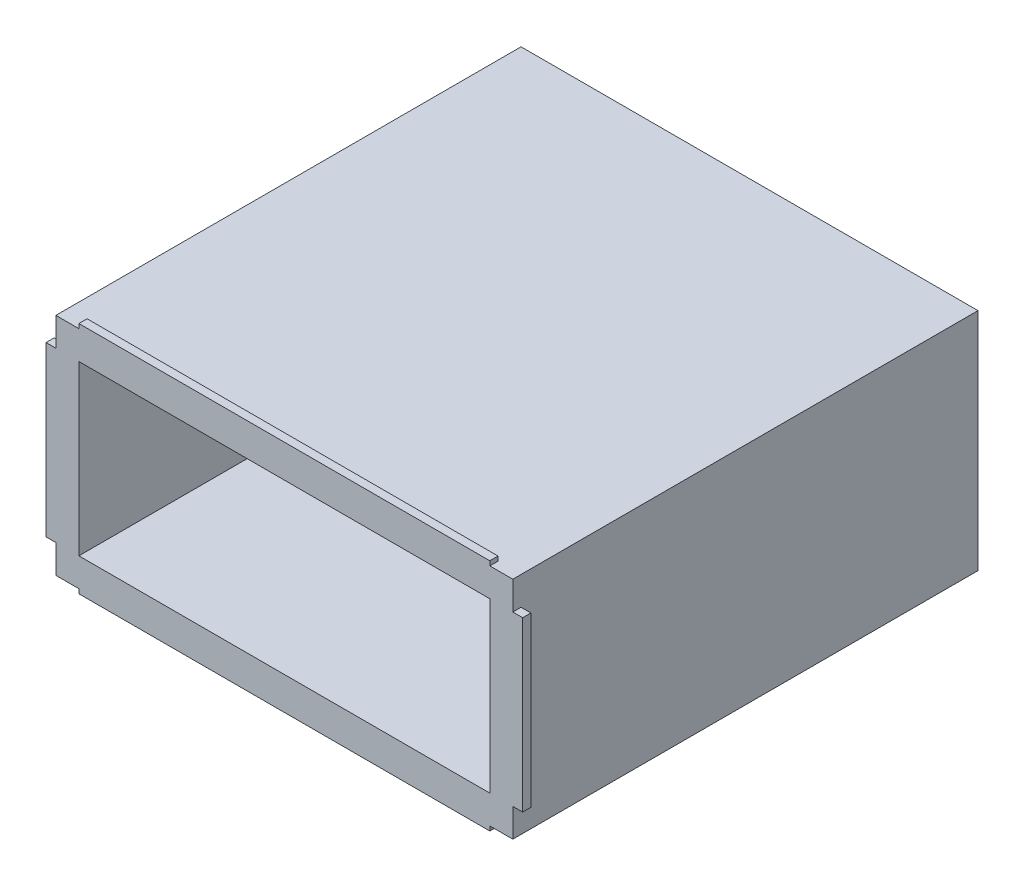
ISO-10303-21;
HEADER;
FILE_DESCRIPTION(('STEP AP214'),'2;1');
FILE_NAME('part.step','',(''),(''),'','','');
FILE_SCHEMA(('AUTOMOTIVE_DESIGN { 1 0 10303 214 1 1 1 1 }'));
ENDSEC;
DATA;
#1=APPLICATION_CONTEXT('core data for automotive mechanical design processes');
#2=APPLICATION_PROTOCOL_DEFINITION('international standard','automotive_design',2000,#1);
#3=PRODUCT_CONTEXT('',#1,'mechanical');
#4=PRODUCT('Part','Part','',(#3));
#5=PRODUCT_RELATED_PRODUCT_CATEGORY('part','',(#4));
#6=PRODUCT_DEFINITION_FORMATION('','',#4);
#7=PRODUCT_DEFINITION_CONTEXT('part definition',#1,'design');
#8=PRODUCT_DEFINITION('design','',#6,#7);
#9=PRODUCT_DEFINITION_SHAPE('','',#8);
#10=(LENGTH_UNIT() NAMED_UNIT(*) SI_UNIT(.MILLI.,.METRE.));
#11=(NAMED_UNIT(*) PLANE_ANGLE_UNIT() SI_UNIT($,.RADIAN.));
#12=(NAMED_UNIT(*) SI_UNIT($,.STERADIAN.) SOLID_ANGLE_UNIT());
#13=UNCERTAINTY_MEASURE_WITH_UNIT(LENGTH_MEASURE(1.E-05),#10,'distance_accuracy_value','');
#14=(GEOMETRIC_REPRESENTATION_CONTEXT(3) GLOBAL_UNCERTAINTY_ASSIGNED_CONTEXT((#13)) GLOBAL_UNIT_ASSIGNED_CONTEXT((#10,
#11,#12)) REPRESENTATION_CONTEXT('',''));
#15=CARTESIAN_POINT('',(0.,0.,0.));
#16=DIRECTION('',(0.,0.,1.));
#17=DIRECTION('',(1.,0.,0.));
#18=AXIS2_PLACEMENT_3D('',#15,#16,#17);
#19=CARTESIAN_POINT('',(6.95,-3.425,14.15));
#20=DIRECTION('',(-1.,0.,0.));
#21=DIRECTION('',(0.,0.,1.));
#22=AXIS2_PLACEMENT_3D('',#19,#20,#21);
#23=PLANE('',#22);
#24=DIRECTION('',(0.,0.,-1.));
#25=VECTOR('',#24,1.);
#26=CARTESIAN_POINT('',(6.95,-2.56,13.9));
#27=LINE('',#26,#25);
#28=CARTESIAN_POINT('',(6.95,-2.56,14.15));
#29=VERTEX_POINT('',#28);
#30=CARTESIAN_POINT('',(6.95,-2.56,13.9));
#31=VERTEX_POINT('',#30);
#32=EDGE_CURVE('E232',#29,#31,#27,.T.);
#33=ORIENTED_EDGE('',*,*,#32,.F.);
#34=DIRECTION('',(0.,1.,0.));
#35=VECTOR('',#34,1.);
#36=CARTESIAN_POINT('',(6.95,-3.425,14.15));
#37=LINE('',#36,#35);
#38=CARTESIAN_POINT('',(6.95,-3.425,14.15));
#39=VERTEX_POINT('',#38);
#40=EDGE_CURVE('E348',#39,#29,#37,.T.);
#41=ORIENTED_EDGE('',*,*,#40,.F.);
#42=DIRECTION('',(0.,0.,-1.));
#43=VECTOR('',#42,1.);
#44=CARTESIAN_POINT('',(6.95,-3.425,14.15));
#45=LINE('',#44,#43);
#46=CARTESIAN_POINT('',(6.95,-3.425,0.));
#47=VERTEX_POINT('',#46);
#48=EDGE_CURVE('E364',#39,#47,#45,.T.);
#49=ORIENTED_EDGE('',*,*,#48,.T.);
#50=DIRECTION('',(0.,1.,0.));
#51=VECTOR('',#50,1.);
#52=CARTESIAN_POINT('',(6.95,-3.425,0.));
#53=LINE('',#52,#51);
#54=CARTESIAN_POINT('',(6.95,3.425,0.));
#55=VERTEX_POINT('',#54);
#56=EDGE_CURVE('E341',#47,#55,#53,.T.);
#57=ORIENTED_EDGE('',*,*,#56,.T.);
#58=DIRECTION('',(0.,0.,-1.));
#59=VECTOR('',#58,1.);
#60=CARTESIAN_POINT('',(6.95,3.425,14.15));
#61=LINE('',#60,#59);
#62=CARTESIAN_POINT('',(6.95,3.425,14.15));
#63=VERTEX_POINT('',#62);
#64=EDGE_CURVE('E11',#63,#55,#61,.T.);
#65=ORIENTED_EDGE('',*,*,#64,.F.);
#66=CARTESIAN_POINT('',(6.95,2.56,14.15));
#67=VERTEX_POINT('',#66);
#68=EDGE_CURVE('E352',#67,#63,#37,.T.);
#69=ORIENTED_EDGE('',*,*,#68,.F.);
#70=DIRECTION('',(0.,0.,1.));
#71=VECTOR('',#70,1.);
#72=CARTESIAN_POINT('',(6.95,2.56,13.9));
#73=LINE('',#72,#71);
#74=CARTESIAN_POINT('',(6.95,2.56,13.9));
#75=VERTEX_POINT('',#74);
#76=EDGE_CURVE('E240',#75,#67,#73,.T.);
#77=ORIENTED_EDGE('',*,*,#76,.F.);
#78=DIRECTION('',(0.,1.,0.));
#79=VECTOR('',#78,1.);
#80=CARTESIAN_POINT('',(6.95,2.56,13.9));
#81=LINE('',#80,#79);
#82=EDGE_CURVE('E55',#31,#75,#81,.T.);
#83=ORIENTED_EDGE('',*,*,#82,.F.);
#84=EDGE_LOOP('',(#33,#41,#49,#57,#65,#69,#77,#83));
#85=FACE_BOUND('',#84,.T.);
#86=ADVANCED_FACE('F33',(#85),#23,.F.);
#87=CARTESIAN_POINT('',(-6.95,3.425,14.15));
#88=DIRECTION('',(0.,-1.,0.));
#89=DIRECTION('',(0.,0.,-1.));
#90=AXIS2_PLACEMENT_3D('',#87,#88,#89);
#91=PLANE('',#90);
#92=DIRECTION('',(0.,0.,1.));
#93=VECTOR('',#92,1.);
#94=CARTESIAN_POINT('',(-6.25,3.425,14.15));
#95=LINE('',#94,#93);
#96=CARTESIAN_POINT('',(-6.25,3.425,13.9));
#97=VERTEX_POINT('',#96);
#98=CARTESIAN_POINT('',(-6.25,3.425,14.15));
#99=VERTEX_POINT('',#98);
#100=EDGE_CURVE('E285',#97,#99,#95,.T.);
#101=ORIENTED_EDGE('',*,*,#100,.F.);
#102=DIRECTION('',(-1.,0.,0.));
#103=VECTOR('',#102,1.);
#104=CARTESIAN_POINT('',(-6.25,3.425,13.9));
#105=LINE('',#104,#103);
#106=CARTESIAN_POINT('',(6.25,3.425,13.9));
#107=VERTEX_POINT('',#106);
#108=EDGE_CURVE('E290',#107,#97,#105,.T.);
#109=ORIENTED_EDGE('',*,*,#108,.F.);
#110=DIRECTION('',(0.,0.,-1.));
#111=VECTOR('',#110,1.);
#112=CARTESIAN_POINT('',(6.25,3.425,14.15));
#113=LINE('',#112,#111);
#114=CARTESIAN_POINT('',(6.25,3.425,14.15));
#115=VERTEX_POINT('',#114);
#116=EDGE_CURVE('E299',#115,#107,#113,.T.);
#117=ORIENTED_EDGE('',*,*,#116,.F.);
#118=DIRECTION('',(-1.,0.,0.));
#119=VECTOR('',#118,1.);
#120=CARTESIAN_POINT('',(-6.95,3.425,14.15));
#121=LINE('',#120,#119);
#122=EDGE_CURVE('E353',#63,#115,#121,.T.);
#123=ORIENTED_EDGE('',*,*,#122,.F.);
#124=ORIENTED_EDGE('',*,*,#64,.T.);
#125=DIRECTION('',(-1.,0.,0.));
#126=VECTOR('',#125,1.);
#127=CARTESIAN_POINT('',(-6.95,3.425,0.));
#128=LINE('',#127,#126);
#129=CARTESIAN_POINT('',(-6.95,3.425,0.));
#130=VERTEX_POINT('',#129);
#131=EDGE_CURVE('E367',#55,#130,#128,.T.);
#132=ORIENTED_EDGE('',*,*,#131,.T.);
#133=DIRECTION('',(0.,0.,-1.));
#134=VECTOR('',#133,1.);
#135=CARTESIAN_POINT('',(-6.95,3.425,14.15));
#136=LINE('',#135,#134);
#137=CARTESIAN_POINT('',(-6.95,3.425,14.15));
#138=VERTEX_POINT('',#137);
#139=EDGE_CURVE('E40',#138,#130,#136,.T.);
#140=ORIENTED_EDGE('',*,*,#139,.F.);
#141=EDGE_CURVE('E351',#99,#138,#121,.T.);
#142=ORIENTED_EDGE('',*,*,#141,.F.);
#143=EDGE_LOOP('',(#101,#109,#117,#123,#124,#132,#140,#142));
#144=FACE_BOUND('',#143,.T.);
#145=ADVANCED_FACE('F412',(#144),#91,.F.);
#146=CARTESIAN_POINT('',(-6.95,-3.425,14.15));
#147=DIRECTION('',(1.,0.,0.));
#148=DIRECTION('',(0.,0.,-1.));
#149=AXIS2_PLACEMENT_3D('',#146,#147,#148);
#150=PLANE('',#149);
#151=DIRECTION('',(0.,1.,0.));
#152=VECTOR('',#151,1.);
#153=CARTESIAN_POINT('',(-6.95,2.56,13.9));
#154=LINE('',#153,#152);
#155=CARTESIAN_POINT('',(-6.95,-2.56,13.9));
#156=VERTEX_POINT('',#155);
#157=CARTESIAN_POINT('',(-6.95,2.56,13.9));
#158=VERTEX_POINT('',#157);
#159=EDGE_CURVE('E47',#156,#158,#154,.T.);
#160=ORIENTED_EDGE('',*,*,#159,.T.);
#161=DIRECTION('',(0.,0.,1.));
#162=VECTOR('',#161,1.);
#163=CARTESIAN_POINT('',(-6.95,2.56,13.9));
#164=LINE('',#163,#162);
#165=CARTESIAN_POINT('',(-6.95,2.56,14.15));
#166=VERTEX_POINT('',#165);
#167=EDGE_CURVE('E210',#158,#166,#164,.T.);
#168=ORIENTED_EDGE('',*,*,#167,.T.);
#169=DIRECTION('',(0.,-1.,0.));
#170=VECTOR('',#169,1.);
#171=CARTESIAN_POINT('',(-6.95,-3.425,14.15));
#172=LINE('',#171,#170);
#173=EDGE_CURVE('E357',#138,#166,#172,.T.);
#174=ORIENTED_EDGE('',*,*,#173,.F.);
#175=ORIENTED_EDGE('',*,*,#139,.T.);
#176=DIRECTION('',(0.,-1.,0.));
#177=VECTOR('',#176,1.);
#178=CARTESIAN_POINT('',(-6.95,-3.425,0.));
#179=LINE('',#178,#177);
#180=CARTESIAN_POINT('',(-6.95,-3.425,0.));
#181=VERTEX_POINT('',#180);
#182=EDGE_CURVE('E369',#130,#181,#179,.T.);
#183=ORIENTED_EDGE('',*,*,#182,.T.);
#184=DIRECTION('',(0.,0.,-1.));
#185=VECTOR('',#184,1.);
#186=CARTESIAN_POINT('',(-6.95,-3.425,14.15));
#187=LINE('',#186,#185);
#188=CARTESIAN_POINT('',(-6.95,-3.425,14.15));
#189=VERTEX_POINT('',#188);
#190=EDGE_CURVE('E375',#189,#181,#187,.T.);
#191=ORIENTED_EDGE('',*,*,#190,.F.);
#192=CARTESIAN_POINT('',(-6.95,-2.56,14.15));
#193=VERTEX_POINT('',#192);
#194=EDGE_CURVE('E356',#193,#189,#172,.T.);
#195=ORIENTED_EDGE('',*,*,#194,.F.);
#196=DIRECTION('',(0.,0.,-1.));
#197=VECTOR('',#196,1.);
#198=CARTESIAN_POINT('',(-6.95,-2.56,13.9));
#199=LINE('',#198,#197);
#200=EDGE_CURVE('E220',#193,#156,#199,.T.);
#201=ORIENTED_EDGE('',*,*,#200,.T.);
#202=EDGE_LOOP('',(#160,#168,#174,#175,#183,#191,#195,#201));
#203=FACE_BOUND('',#202,.T.);
#204=ADVANCED_FACE('F382',(#203),#150,.F.);
#205=CARTESIAN_POINT('',(-6.95,-3.425,14.15));
#206=DIRECTION('',(0.,1.,0.));
#207=DIRECTION('',(0.,0.,1.));
#208=AXIS2_PLACEMENT_3D('',#205,#206,#207);
#209=PLANE('',#208);
#210=DIRECTION('',(-1.,0.,0.));
#211=VECTOR('',#210,1.);
#212=CARTESIAN_POINT('',(-6.25,-3.425,13.9));
#213=LINE('',#212,#211);
#214=CARTESIAN_POINT('',(6.25,-3.425,13.9));
#215=VERTEX_POINT('',#214);
#216=CARTESIAN_POINT('',(-6.25,-3.425,13.9));
#217=VERTEX_POINT('',#216);
#218=EDGE_CURVE('E272',#215,#217,#213,.T.);
#219=ORIENTED_EDGE('',*,*,#218,.T.);
#220=DIRECTION('',(0.,0.,1.));
#221=VECTOR('',#220,1.);
#222=CARTESIAN_POINT('',(-6.25,-3.425,14.15));
#223=LINE('',#222,#221);
#224=CARTESIAN_POINT('',(-6.25,-3.425,14.15));
#225=VERTEX_POINT('',#224);
#226=EDGE_CURVE('E255',#217,#225,#223,.T.);
#227=ORIENTED_EDGE('',*,*,#226,.T.);
#228=DIRECTION('',(1.,0.,0.));
#229=VECTOR('',#228,1.);
#230=CARTESIAN_POINT('',(-6.95,-3.425,14.15));
#231=LINE('',#230,#229);
#232=EDGE_CURVE('E361',#189,#225,#231,.T.);
#233=ORIENTED_EDGE('',*,*,#232,.F.);
#234=ORIENTED_EDGE('',*,*,#190,.T.);
#235=DIRECTION('',(1.,0.,0.));
#236=VECTOR('',#235,1.);
#237=CARTESIAN_POINT('',(-6.95,-3.425,0.));
#238=LINE('',#237,#236);
#239=EDGE_CURVE('E371',#181,#47,#238,.T.);
#240=ORIENTED_EDGE('',*,*,#239,.T.);
#241=ORIENTED_EDGE('',*,*,#48,.F.);
#242=CARTESIAN_POINT('',(6.25,-3.425,14.15));
#243=VERTEX_POINT('',#242);
#244=EDGE_CURVE('E360',#243,#39,#231,.T.);
#245=ORIENTED_EDGE('',*,*,#244,.F.);
#246=DIRECTION('',(0.,0.,-1.));
#247=VECTOR('',#246,1.);
#248=CARTESIAN_POINT('',(6.25,-3.425,14.15));
#249=LINE('',#248,#247);
#250=EDGE_CURVE('E260',#243,#215,#249,.T.);
#251=ORIENTED_EDGE('',*,*,#250,.T.);
#252=EDGE_LOOP('',(#219,#227,#233,#234,#240,#241,#245,#251));
#253=FACE_BOUND('',#252,.T.);
#254=ADVANCED_FACE('F391',(#253),#209,.F.);
#255=CARTESIAN_POINT('',(0.,0.,14.15));
#256=DIRECTION('',(0.,0.,-1.));
#257=DIRECTION('',(-1.,0.,0.));
#258=AXIS2_PLACEMENT_3D('',#255,#256,#257);
#259=PLANE('',#258);
#260=DIRECTION('',(-1.,0.,0.));
#261=VECTOR('',#260,1.);
#262=CARTESIAN_POINT('',(-6.25,2.56,14.15));
#263=LINE('',#262,#261);
#264=CARTESIAN_POINT('',(6.25,2.56,14.15));
#265=VERTEX_POINT('',#264);
#266=CARTESIAN_POINT('',(-6.25,2.56,14.15));
#267=VERTEX_POINT('',#266);
#268=EDGE_CURVE('E331',#265,#267,#263,.T.);
#269=ORIENTED_EDGE('',*,*,#268,.F.);
#270=DIRECTION('',(0.,1.,0.));
#271=VECTOR('',#270,1.);
#272=CARTESIAN_POINT('',(6.25,-2.56,14.15));
#273=LINE('',#272,#271);
#274=CARTESIAN_POINT('',(6.25,-2.56,14.15));
#275=VERTEX_POINT('',#274);
#276=EDGE_CURVE('E315',#275,#265,#273,.T.);
#277=ORIENTED_EDGE('',*,*,#276,.F.);
#278=DIRECTION('',(1.,0.,0.));
#279=VECTOR('',#278,1.);
#280=CARTESIAN_POINT('',(-6.25,-2.56,14.15));
#281=LINE('',#280,#279);
#282=CARTESIAN_POINT('',(-6.25,-2.56,14.15));
#283=VERTEX_POINT('',#282);
#284=EDGE_CURVE('E320',#283,#275,#281,.T.);
#285=ORIENTED_EDGE('',*,*,#284,.F.);
#286=DIRECTION('',(0.,-1.,0.));
#287=VECTOR('',#286,1.);
#288=CARTESIAN_POINT('',(-6.25,-2.56,14.15));
#289=LINE('',#288,#287);
#290=EDGE_CURVE('E334',#267,#283,#289,.T.);
#291=ORIENTED_EDGE('',*,*,#290,.F.);
#292=EDGE_LOOP('',(#269,#277,#285,#291));
#293=FACE_BOUND('',#292,.T.);
#294=ORIENTED_EDGE('',*,*,#40,.T.);
#295=DIRECTION('',(-1.,0.,0.));
#296=VECTOR('',#295,1.);
#297=CARTESIAN_POINT('',(7.25,-2.56,14.15));
#298=LINE('',#297,#296);
#299=CARTESIAN_POINT('',(7.25,-2.56,14.15));
#300=VERTEX_POINT('',#299);
#301=EDGE_CURVE('E246',#300,#29,#298,.T.);
#302=ORIENTED_EDGE('',*,*,#301,.F.);
#303=DIRECTION('',(0.,-1.,0.));
#304=VECTOR('',#303,1.);
#305=CARTESIAN_POINT('',(7.25,2.56,14.15));
#306=LINE('',#305,#304);
#307=CARTESIAN_POINT('',(7.25,2.56,14.15));
#308=VERTEX_POINT('',#307);
#309=EDGE_CURVE('E234',#308,#300,#306,.T.);
#310=ORIENTED_EDGE('',*,*,#309,.F.);
#311=DIRECTION('',(-1.,0.,0.));
#312=VECTOR('',#311,1.);
#313=CARTESIAN_POINT('',(7.25,2.56,14.15));
#314=LINE('',#313,#312);
#315=EDGE_CURVE('E249',#308,#67,#314,.T.);
#316=ORIENTED_EDGE('',*,*,#315,.T.);
#317=ORIENTED_EDGE('',*,*,#68,.T.);
#318=ORIENTED_EDGE('',*,*,#122,.T.);
#319=DIRECTION('',(0.,-1.,0.));
#320=VECTOR('',#319,1.);
#321=CARTESIAN_POINT('',(6.25,3.56,14.15));
#322=LINE('',#321,#320);
#323=CARTESIAN_POINT('',(6.25,3.56,14.15));
#324=VERTEX_POINT('',#323);
#325=EDGE_CURVE('E309',#324,#115,#322,.T.);
#326=ORIENTED_EDGE('',*,*,#325,.F.);
#327=DIRECTION('',(1.,0.,0.));
#328=VECTOR('',#327,1.);
#329=CARTESIAN_POINT('',(-6.25,3.56,14.15));
#330=LINE('',#329,#328);
#331=CARTESIAN_POINT('',(-6.25,3.56,14.15));
#332=VERTEX_POINT('',#331);
#333=EDGE_CURVE('E289',#332,#324,#330,.T.);
#334=ORIENTED_EDGE('',*,*,#333,.F.);
#335=DIRECTION('',(0.,-1.,0.));
#336=VECTOR('',#335,1.);
#337=CARTESIAN_POINT('',(-6.25,3.56,14.15));
#338=LINE('',#337,#336);
#339=EDGE_CURVE('E312',#332,#99,#338,.T.);
#340=ORIENTED_EDGE('',*,*,#339,.T.);
#341=ORIENTED_EDGE('',*,*,#141,.T.);
#342=ORIENTED_EDGE('',*,*,#173,.T.);
#343=DIRECTION('',(1.,0.,0.));
#344=VECTOR('',#343,1.);
#345=CARTESIAN_POINT('',(-7.25,2.56,14.15));
#346=LINE('',#345,#344);
#347=CARTESIAN_POINT('',(-7.25,2.56,14.15));
#348=VERTEX_POINT('',#347);
#349=EDGE_CURVE('E225',#348,#166,#346,.T.);
#350=ORIENTED_EDGE('',*,*,#349,.F.);
#351=DIRECTION('',(0.,-1.,0.));
#352=VECTOR('',#351,1.);
#353=CARTESIAN_POINT('',(-7.25,2.56,14.15));
#354=LINE('',#353,#352);
#355=CARTESIAN_POINT('',(-7.25,-2.56,14.15));
#356=VERTEX_POINT('',#355);
#357=EDGE_CURVE('E213',#348,#356,#354,.T.);
#358=ORIENTED_EDGE('',*,*,#357,.T.);
#359=DIRECTION('',(1.,0.,0.));
#360=VECTOR('',#359,1.);
#361=CARTESIAN_POINT('',(-7.25,-2.56,14.15));
#362=LINE('',#361,#360);
#363=EDGE_CURVE('E200',#356,#193,#362,.T.);
#364=ORIENTED_EDGE('',*,*,#363,.T.);
#365=ORIENTED_EDGE('',*,*,#194,.T.);
#366=ORIENTED_EDGE('',*,*,#232,.T.);
#367=DIRECTION('',(0.,1.,0.));
#368=VECTOR('',#367,1.);
#369=CARTESIAN_POINT('',(-6.25,-3.56,14.15));
#370=LINE('',#369,#368);
#371=CARTESIAN_POINT('',(-6.25,-3.56,14.15));
#372=VERTEX_POINT('',#371);
#373=EDGE_CURVE('E269',#372,#225,#370,.T.);
#374=ORIENTED_EDGE('',*,*,#373,.F.);
#375=DIRECTION('',(1.,0.,0.));
#376=VECTOR('',#375,1.);
#377=CARTESIAN_POINT('',(-6.25,-3.56,14.15));
#378=LINE('',#377,#376);
#379=CARTESIAN_POINT('',(6.25,-3.56,14.15));
#380=VERTEX_POINT('',#379);
#381=EDGE_CURVE('E266',#372,#380,#378,.T.);
#382=ORIENTED_EDGE('',*,*,#381,.T.);
#383=DIRECTION('',(0.,1.,0.));
#384=VECTOR('',#383,1.);
#385=CARTESIAN_POINT('',(6.25,-3.56,14.15));
#386=LINE('',#385,#384);
#387=EDGE_CURVE('E278',#380,#243,#386,.T.);
#388=ORIENTED_EDGE('',*,*,#387,.T.);
#389=ORIENTED_EDGE('',*,*,#244,.T.);
#390=EDGE_LOOP('',(#294,#302,#310,#316,#317,#318,#326,#334,#340,#341,#342,#350,#358,#364,#365,
#366,#374,#382,#388,#389));
#391=FACE_BOUND('',#390,.T.);
#392=ADVANCED_FACE('F398',(#293,#391),#259,.F.);
#393=CARTESIAN_POINT('',(0.,0.,0.));
#394=DIRECTION('',(0.,0.,-1.));
#395=DIRECTION('',(-1.,0.,0.));
#396=AXIS2_PLACEMENT_3D('',#393,#394,#395);
#397=PLANE('',#396);
#398=ORIENTED_EDGE('',*,*,#56,.F.);
#399=ORIENTED_EDGE('',*,*,#239,.F.);
#400=ORIENTED_EDGE('',*,*,#182,.F.);
#401=ORIENTED_EDGE('',*,*,#131,.F.);
#402=EDGE_LOOP('',(#398,#399,#400,#401));
#403=FACE_BOUND('',#402,.T.);
#404=ADVANCED_FACE('F388',(#403),#397,.T.);
#405=CARTESIAN_POINT('',(6.25,-2.56,1.15));
#406=DIRECTION('',(1.,0.,0.));
#407=DIRECTION('',(0.,0.,-1.));
#408=AXIS2_PLACEMENT_3D('',#405,#406,#407);
#409=PLANE('',#408);
#410=ORIENTED_EDGE('',*,*,#276,.T.);
#411=DIRECTION('',(0.,0.,1.));
#412=VECTOR('',#411,1.);
#413=CARTESIAN_POINT('',(6.25,2.56,1.15));
#414=LINE('',#413,#412);
#415=CARTESIAN_POINT('',(6.25,2.56,1.15));
#416=VERTEX_POINT('',#415);
#417=EDGE_CURVE('E329',#416,#265,#414,.T.);
#418=ORIENTED_EDGE('',*,*,#417,.F.);
#419=DIRECTION('',(0.,1.,0.));
#420=VECTOR('',#419,1.);
#421=CARTESIAN_POINT('',(6.25,-2.56,1.15));
#422=LINE('',#421,#420);
#423=CARTESIAN_POINT('',(6.25,-2.56,1.15));
#424=VERTEX_POINT('',#423);
#425=EDGE_CURVE('E316',#424,#416,#422,.T.);
#426=ORIENTED_EDGE('',*,*,#425,.F.);
#427=DIRECTION('',(0.,0.,1.));
#428=VECTOR('',#427,1.);
#429=CARTESIAN_POINT('',(6.25,-2.56,1.15));
#430=LINE('',#429,#428);
#431=EDGE_CURVE('E339',#424,#275,#430,.T.);
#432=ORIENTED_EDGE('',*,*,#431,.T.);
#433=EDGE_LOOP('',(#410,#418,#426,#432));
#434=FACE_BOUND('',#433,.T.);
#435=ADVANCED_FACE('F450',(#434),#409,.F.);
#436=CARTESIAN_POINT('',(-6.25,-2.56,1.15));
#437=DIRECTION('',(0.,-1.,0.));
#438=DIRECTION('',(0.,0.,-1.));
#439=AXIS2_PLACEMENT_3D('',#436,#437,#438);
#440=PLANE('',#439);
#441=ORIENTED_EDGE('',*,*,#284,.T.);
#442=ORIENTED_EDGE('',*,*,#431,.F.);
#443=DIRECTION('',(1.,0.,0.));
#444=VECTOR('',#443,1.);
#445=CARTESIAN_POINT('',(-6.25,-2.56,1.15));
#446=LINE('',#445,#444);
#447=CARTESIAN_POINT('',(-6.25,-2.56,1.15));
#448=VERTEX_POINT('',#447);
#449=EDGE_CURVE('E326',#448,#424,#446,.T.);
#450=ORIENTED_EDGE('',*,*,#449,.F.);
#451=DIRECTION('',(0.,0.,1.));
#452=VECTOR('',#451,1.);
#453=CARTESIAN_POINT('',(-6.25,-2.56,1.15));
#454=LINE('',#453,#452);
#455=EDGE_CURVE('E342',#448,#283,#454,.T.);
#456=ORIENTED_EDGE('',*,*,#455,.T.);
#457=EDGE_LOOP('',(#441,#442,#450,#456));
#458=FACE_BOUND('',#457,.T.);
#459=ADVANCED_FACE('F456',(#458),#440,.F.);
#460=CARTESIAN_POINT('',(-6.25,-2.56,1.15));
#461=DIRECTION('',(-1.,0.,0.));
#462=DIRECTION('',(0.,0.,1.));
#463=AXIS2_PLACEMENT_3D('',#460,#461,#462);
#464=PLANE('',#463);
#465=ORIENTED_EDGE('',*,*,#290,.T.);
#466=ORIENTED_EDGE('',*,*,#455,.F.);
#467=DIRECTION('',(0.,-1.,0.));
#468=VECTOR('',#467,1.);
#469=CARTESIAN_POINT('',(-6.25,-2.56,1.15));
#470=LINE('',#469,#468);
#471=CARTESIAN_POINT('',(-6.25,2.56,1.15));
#472=VERTEX_POINT('',#471);
#473=EDGE_CURVE('E323',#472,#448,#470,.T.);
#474=ORIENTED_EDGE('',*,*,#473,.F.);
#475=DIRECTION('',(0.,0.,1.));
#476=VECTOR('',#475,1.);
#477=CARTESIAN_POINT('',(-6.25,2.56,1.15));
#478=LINE('',#477,#476);
#479=EDGE_CURVE('E344',#472,#267,#478,.T.);
#480=ORIENTED_EDGE('',*,*,#479,.T.);
#481=EDGE_LOOP('',(#465,#466,#474,#480));
#482=FACE_BOUND('',#481,.T.);
#483=ADVANCED_FACE('F462',(#482),#464,.F.);
#484=CARTESIAN_POINT('',(-6.25,2.56,1.15));
#485=DIRECTION('',(0.,1.,0.));
#486=DIRECTION('',(0.,0.,1.));
#487=AXIS2_PLACEMENT_3D('',#484,#485,#486);
#488=PLANE('',#487);
#489=ORIENTED_EDGE('',*,*,#268,.T.);
#490=ORIENTED_EDGE('',*,*,#479,.F.);
#491=DIRECTION('',(-1.,0.,0.));
#492=VECTOR('',#491,1.);
#493=CARTESIAN_POINT('',(-6.25,2.56,1.15));
#494=LINE('',#493,#492);
#495=EDGE_CURVE('E319',#416,#472,#494,.T.);
#496=ORIENTED_EDGE('',*,*,#495,.F.);
#497=ORIENTED_EDGE('',*,*,#417,.T.);
#498=EDGE_LOOP('',(#489,#490,#496,#497));
#499=FACE_BOUND('',#498,.T.);
#500=ADVANCED_FACE('F458',(#499),#488,.F.);
#501=CARTESIAN_POINT('',(0.,0.,1.15));
#502=DIRECTION('',(0.,0.,-1.));
#503=DIRECTION('',(-1.,0.,0.));
#504=AXIS2_PLACEMENT_3D('',#501,#502,#503);
#505=PLANE('',#504);
#506=ORIENTED_EDGE('',*,*,#425,.T.);
#507=ORIENTED_EDGE('',*,*,#495,.T.);
#508=ORIENTED_EDGE('',*,*,#473,.T.);
#509=ORIENTED_EDGE('',*,*,#449,.T.);
#510=EDGE_LOOP('',(#506,#507,#508,#509));
#511=FACE_BOUND('',#510,.T.);
#512=ADVANCED_FACE('F461',(#511),#505,.F.);
#513=CARTESIAN_POINT('',(-6.25,3.56,14.15));
#514=DIRECTION('',(1.,0.,0.));
#515=DIRECTION('',(0.,0.,-1.));
#516=AXIS2_PLACEMENT_3D('',#513,#514,#515);
#517=PLANE('',#516);
#518=ORIENTED_EDGE('',*,*,#100,.T.);
#519=ORIENTED_EDGE('',*,*,#339,.F.);
#520=DIRECTION('',(0.,0.,1.));
#521=VECTOR('',#520,1.);
#522=CARTESIAN_POINT('',(-6.25,3.56,14.15));
#523=LINE('',#522,#521);
#524=CARTESIAN_POINT('',(-6.25,3.56,13.9));
#525=VERTEX_POINT('',#524);
#526=EDGE_CURVE('E286',#525,#332,#523,.T.);
#527=ORIENTED_EDGE('',*,*,#526,.F.);
#528=DIRECTION('',(0.,-1.,0.));
#529=VECTOR('',#528,1.);
#530=CARTESIAN_POINT('',(-6.25,3.56,13.9));
#531=LINE('',#530,#529);
#532=EDGE_CURVE('E296',#525,#97,#531,.T.);
#533=ORIENTED_EDGE('',*,*,#532,.T.);
#534=EDGE_LOOP('',(#518,#519,#527,#533));
#535=FACE_BOUND('',#534,.T.);
#536=ADVANCED_FACE('F425',(#535),#517,.F.);
#537=CARTESIAN_POINT('',(6.25,3.56,14.15));
#538=DIRECTION('',(-1.,0.,0.));
#539=DIRECTION('',(0.,0.,1.));
#540=AXIS2_PLACEMENT_3D('',#537,#538,#539);
#541=PLANE('',#540);
#542=ORIENTED_EDGE('',*,*,#116,.T.);
#543=DIRECTION('',(0.,-1.,0.));
#544=VECTOR('',#543,1.);
#545=CARTESIAN_POINT('',(6.25,3.56,13.9));
#546=LINE('',#545,#544);
#547=CARTESIAN_POINT('',(6.25,3.56,13.9));
#548=VERTEX_POINT('',#547);
#549=EDGE_CURVE('E306',#548,#107,#546,.T.);
#550=ORIENTED_EDGE('',*,*,#549,.F.);
#551=DIRECTION('',(0.,0.,-1.));
#552=VECTOR('',#551,1.);
#553=CARTESIAN_POINT('',(6.25,3.56,14.15));
#554=LINE('',#553,#552);
#555=EDGE_CURVE('E292',#324,#548,#554,.T.);
#556=ORIENTED_EDGE('',*,*,#555,.F.);
#557=ORIENTED_EDGE('',*,*,#325,.T.);
#558=EDGE_LOOP('',(#542,#550,#556,#557));
#559=FACE_BOUND('',#558,.T.);
#560=ADVANCED_FACE('F416',(#559),#541,.F.);
#561=CARTESIAN_POINT('',(-6.25,3.56,13.9));
#562=DIRECTION('',(0.,0.,1.));
#563=DIRECTION('',(1.,0.,0.));
#564=AXIS2_PLACEMENT_3D('',#561,#562,#563);
#565=PLANE('',#564);
#566=ORIENTED_EDGE('',*,*,#108,.T.);
#567=ORIENTED_EDGE('',*,*,#532,.F.);
#568=DIRECTION('',(-1.,0.,0.));
#569=VECTOR('',#568,1.);
#570=CARTESIAN_POINT('',(-6.25,3.56,13.9));
#571=LINE('',#570,#569);
#572=EDGE_CURVE('E294',#548,#525,#571,.T.);
#573=ORIENTED_EDGE('',*,*,#572,.F.);
#574=ORIENTED_EDGE('',*,*,#549,.T.);
#575=EDGE_LOOP('',(#566,#567,#573,#574));
#576=FACE_BOUND('',#575,.T.);
#577=ADVANCED_FACE('F427',(#576),#565,.F.);
#578=CARTESIAN_POINT('',(0.,3.56,0.));
#579=DIRECTION('',(0.,-1.,0.));
#580=DIRECTION('',(0.,0.,-1.));
#581=AXIS2_PLACEMENT_3D('',#578,#579,#580);
#582=PLANE('',#581);
#583=ORIENTED_EDGE('',*,*,#526,.T.);
#584=ORIENTED_EDGE('',*,*,#333,.T.);
#585=ORIENTED_EDGE('',*,*,#555,.T.);
#586=ORIENTED_EDGE('',*,*,#572,.T.);
#587=EDGE_LOOP('',(#583,#584,#585,#586));
#588=FACE_BOUND('',#587,.T.);
#589=ADVANCED_FACE('F420',(#588),#582,.F.);
#590=CARTESIAN_POINT('',(-6.25,-3.56,14.15));
#591=DIRECTION('',(-1.,0.,0.));
#592=DIRECTION('',(0.,0.,1.));
#593=AXIS2_PLACEMENT_3D('',#590,#591,#592);
#594=PLANE('',#593);
#595=ORIENTED_EDGE('',*,*,#226,.F.);
#596=DIRECTION('',(0.,1.,0.));
#597=VECTOR('',#596,1.);
#598=CARTESIAN_POINT('',(-6.25,-3.56,13.9));
#599=LINE('',#598,#597);
#600=CARTESIAN_POINT('',(-6.25,-3.56,13.9));
#601=VERTEX_POINT('',#600);
#602=EDGE_CURVE('E282',#601,#217,#599,.T.);
#603=ORIENTED_EDGE('',*,*,#602,.F.);
#604=DIRECTION('',(0.,0.,1.));
#605=VECTOR('',#604,1.);
#606=CARTESIAN_POINT('',(-6.25,-3.56,14.15));
#607=LINE('',#606,#605);
#608=EDGE_CURVE('E256',#601,#372,#607,.T.);
#609=ORIENTED_EDGE('',*,*,#608,.T.);
#610=ORIENTED_EDGE('',*,*,#373,.T.);
#611=EDGE_LOOP('',(#595,#603,#609,#610));
#612=FACE_BOUND('',#611,.T.);
#613=ADVANCED_FACE('F434',(#612),#594,.T.);
#614=CARTESIAN_POINT('',(-6.25,-3.56,13.9));
#615=DIRECTION('',(0.,0.,-1.));
#616=DIRECTION('',(-1.,0.,0.));
#617=AXIS2_PLACEMENT_3D('',#614,#615,#616);
#618=PLANE('',#617);
#619=ORIENTED_EDGE('',*,*,#218,.F.);
#620=DIRECTION('',(0.,1.,0.));
#621=VECTOR('',#620,1.);
#622=CARTESIAN_POINT('',(6.25,-3.56,13.9));
#623=LINE('',#622,#621);
#624=CARTESIAN_POINT('',(6.25,-3.56,13.9));
#625=VERTEX_POINT('',#624);
#626=EDGE_CURVE('E280',#625,#215,#623,.T.);
#627=ORIENTED_EDGE('',*,*,#626,.F.);
#628=DIRECTION('',(-1.,0.,0.));
#629=VECTOR('',#628,1.);
#630=CARTESIAN_POINT('',(-6.25,-3.56,13.9));
#631=LINE('',#630,#629);
#632=EDGE_CURVE('E259',#625,#601,#631,.T.);
#633=ORIENTED_EDGE('',*,*,#632,.T.);
#634=ORIENTED_EDGE('',*,*,#602,.T.);
#635=EDGE_LOOP('',(#619,#627,#633,#634));
#636=FACE_BOUND('',#635,.T.);
#637=ADVANCED_FACE('F510',(#636),#618,.T.);
#638=CARTESIAN_POINT('',(6.25,-3.56,14.15));
#639=DIRECTION('',(1.,0.,0.));
#640=DIRECTION('',(0.,0.,-1.));
#641=AXIS2_PLACEMENT_3D('',#638,#639,#640);
#642=PLANE('',#641);
#643=ORIENTED_EDGE('',*,*,#250,.F.);
#644=ORIENTED_EDGE('',*,*,#387,.F.);
#645=DIRECTION('',(0.,0.,-1.));
#646=VECTOR('',#645,1.);
#647=CARTESIAN_POINT('',(6.25,-3.56,14.15));
#648=LINE('',#647,#646);
#649=EDGE_CURVE('E263',#380,#625,#648,.T.);
#650=ORIENTED_EDGE('',*,*,#649,.T.);
#651=ORIENTED_EDGE('',*,*,#626,.T.);
#652=EDGE_LOOP('',(#643,#644,#650,#651));
#653=FACE_BOUND('',#652,.T.);
#654=ADVANCED_FACE('F520',(#653),#642,.T.);
#655=CARTESIAN_POINT('',(0.,-3.56,0.));
#656=DIRECTION('',(0.,1.,0.));
#657=DIRECTION('',(0.,0.,-1.));
#658=AXIS2_PLACEMENT_3D('',#655,#656,#657);
#659=PLANE('',#658);
#660=ORIENTED_EDGE('',*,*,#608,.F.);
#661=ORIENTED_EDGE('',*,*,#632,.F.);
#662=ORIENTED_EDGE('',*,*,#649,.F.);
#663=ORIENTED_EDGE('',*,*,#381,.F.);
#664=EDGE_LOOP('',(#660,#661,#662,#663));
#665=FACE_BOUND('',#664,.T.);
#666=ADVANCED_FACE('F530',(#665),#659,.F.);
#667=CARTESIAN_POINT('',(7.25,2.56,13.9));
#668=DIRECTION('',(0.,0.,1.));
#669=DIRECTION('',(1.,0.,0.));
#670=AXIS2_PLACEMENT_3D('',#667,#668,#669);
#671=PLANE('',#670);
#672=ORIENTED_EDGE('',*,*,#82,.T.);
#673=DIRECTION('',(-1.,0.,0.));
#674=VECTOR('',#673,1.);
#675=CARTESIAN_POINT('',(7.25,2.56,13.9));
#676=LINE('',#675,#674);
#677=CARTESIAN_POINT('',(7.25,2.56,13.9));
#678=VERTEX_POINT('',#677);
#679=EDGE_CURVE('E252',#678,#75,#676,.T.);
#680=ORIENTED_EDGE('',*,*,#679,.F.);
#681=DIRECTION('',(0.,1.,0.));
#682=VECTOR('',#681,1.);
#683=CARTESIAN_POINT('',(7.25,2.56,13.9));
#684=LINE('',#683,#682);
#685=CARTESIAN_POINT('',(7.25,-2.56,13.9));
#686=VERTEX_POINT('',#685);
#687=EDGE_CURVE('E228',#686,#678,#684,.T.);
#688=ORIENTED_EDGE('',*,*,#687,.F.);
#689=DIRECTION('',(-1.,0.,0.));
#690=VECTOR('',#689,1.);
#691=CARTESIAN_POINT('',(7.25,-2.56,13.9));
#692=LINE('',#691,#690);
#693=EDGE_CURVE('E238',#686,#31,#692,.T.);
#694=ORIENTED_EDGE('',*,*,#693,.T.);
#695=EDGE_LOOP('',(#672,#680,#688,#694));
#696=FACE_BOUND('',#695,.T.);
#697=ADVANCED_FACE('F539',(#696),#671,.F.);
#698=CARTESIAN_POINT('',(7.25,2.56,13.9));
#699=DIRECTION('',(0.,-1.,0.));
#700=DIRECTION('',(0.,0.,-1.));
#701=AXIS2_PLACEMENT_3D('',#698,#699,#700);
#702=PLANE('',#701);
#703=ORIENTED_EDGE('',*,*,#76,.T.);
#704=ORIENTED_EDGE('',*,*,#315,.F.);
#705=DIRECTION('',(0.,0.,1.));
#706=VECTOR('',#705,1.);
#707=CARTESIAN_POINT('',(7.25,2.56,13.9));
#708=LINE('',#707,#706);
#709=EDGE_CURVE('E231',#678,#308,#708,.T.);
#710=ORIENTED_EDGE('',*,*,#709,.F.);
#711=ORIENTED_EDGE('',*,*,#679,.T.);
#712=EDGE_LOOP('',(#703,#704,#710,#711));
#713=FACE_BOUND('',#712,.T.);
#714=ADVANCED_FACE('F411',(#713),#702,.F.);
#715=CARTESIAN_POINT('',(7.25,-2.56,13.9));
#716=DIRECTION('',(0.,1.,0.));
#717=DIRECTION('',(0.,0.,1.));
#718=AXIS2_PLACEMENT_3D('',#715,#716,#717);
#719=PLANE('',#718);
#720=ORIENTED_EDGE('',*,*,#32,.T.);
#721=ORIENTED_EDGE('',*,*,#693,.F.);
#722=DIRECTION('',(0.,0.,-1.));
#723=VECTOR('',#722,1.);
#724=CARTESIAN_POINT('',(7.25,-2.56,13.9));
#725=LINE('',#724,#723);
#726=EDGE_CURVE('E236',#300,#686,#725,.T.);
#727=ORIENTED_EDGE('',*,*,#726,.F.);
#728=ORIENTED_EDGE('',*,*,#301,.T.);
#729=EDGE_LOOP('',(#720,#721,#727,#728));
#730=FACE_BOUND('',#729,.T.);
#731=ADVANCED_FACE('F402',(#730),#719,.F.);
#732=CARTESIAN_POINT('',(7.25,0.,0.));
#733=DIRECTION('',(-1.,0.,0.));
#734=DIRECTION('',(0.,0.,1.));
#735=AXIS2_PLACEMENT_3D('',#732,#733,#734);
#736=PLANE('',#735);
#737=ORIENTED_EDGE('',*,*,#687,.T.);
#738=ORIENTED_EDGE('',*,*,#709,.T.);
#739=ORIENTED_EDGE('',*,*,#309,.T.);
#740=ORIENTED_EDGE('',*,*,#726,.T.);
#741=EDGE_LOOP('',(#737,#738,#739,#740));
#742=FACE_BOUND('',#741,.T.);
#743=ADVANCED_FACE('F406',(#742),#736,.F.);
#744=CARTESIAN_POINT('',(-7.25,2.56,13.9));
#745=DIRECTION('',(0.,0.,-1.));
#746=DIRECTION('',(-1.,0.,0.));
#747=AXIS2_PLACEMENT_3D('',#744,#745,#746);
#748=PLANE('',#747);
#749=ORIENTED_EDGE('',*,*,#159,.F.);
#750=DIRECTION('',(1.,0.,0.));
#751=VECTOR('',#750,1.);
#752=CARTESIAN_POINT('',(-7.25,-2.56,13.9));
#753=LINE('',#752,#751);
#754=CARTESIAN_POINT('',(-7.25,-2.56,13.9));
#755=VERTEX_POINT('',#754);
#756=EDGE_CURVE('E191',#755,#156,#753,.T.);
#757=ORIENTED_EDGE('',*,*,#756,.F.);
#758=DIRECTION('',(0.,1.,0.));
#759=VECTOR('',#758,1.);
#760=CARTESIAN_POINT('',(-7.25,2.56,13.9));
#761=LINE('',#760,#759);
#762=CARTESIAN_POINT('',(-7.25,2.56,13.9));
#763=VERTEX_POINT('',#762);
#764=EDGE_CURVE('E194',#755,#763,#761,.T.);
#765=ORIENTED_EDGE('',*,*,#764,.T.);
#766=DIRECTION('',(1.,0.,0.));
#767=VECTOR('',#766,1.);
#768=CARTESIAN_POINT('',(-7.25,2.56,13.9));
#769=LINE('',#768,#767);
#770=EDGE_CURVE('E218',#763,#158,#769,.T.);
#771=ORIENTED_EDGE('',*,*,#770,.T.);
#772=EDGE_LOOP('',(#749,#757,#765,#771));
#773=FACE_BOUND('',#772,.T.);
#774=ADVANCED_FACE('F193',(#773),#748,.T.);
#775=CARTESIAN_POINT('',(-7.25,-2.56,13.9));
#776=DIRECTION('',(0.,-1.,0.));
#777=DIRECTION('',(0.,0.,-1.));
#778=AXIS2_PLACEMENT_3D('',#775,#776,#777);
#779=PLANE('',#778);
#780=ORIENTED_EDGE('',*,*,#200,.F.);
#781=ORIENTED_EDGE('',*,*,#363,.F.);
#782=DIRECTION('',(0.,0.,-1.));
#783=VECTOR('',#782,1.);
#784=CARTESIAN_POINT('',(-7.25,-2.56,13.9));
#785=LINE('',#784,#783);
#786=EDGE_CURVE('E206',#356,#755,#785,.T.);
#787=ORIENTED_EDGE('',*,*,#786,.T.);
#788=ORIENTED_EDGE('',*,*,#756,.T.);
#789=EDGE_LOOP('',(#780,#781,#787,#788));
#790=FACE_BOUND('',#789,.T.);
#791=ADVANCED_FACE('F212',(#790),#779,.T.);
#792=CARTESIAN_POINT('',(-7.25,2.56,13.9));
#793=DIRECTION('',(0.,1.,0.));
#794=DIRECTION('',(0.,0.,1.));
#795=AXIS2_PLACEMENT_3D('',#792,#793,#794);
#796=PLANE('',#795);
#797=ORIENTED_EDGE('',*,*,#167,.F.);
#798=ORIENTED_EDGE('',*,*,#770,.F.);
#799=DIRECTION('',(0.,0.,1.));
#800=VECTOR('',#799,1.);
#801=CARTESIAN_POINT('',(-7.25,2.56,13.9));
#802=LINE('',#801,#800);
#803=EDGE_CURVE('E209',#763,#348,#802,.T.);
#804=ORIENTED_EDGE('',*,*,#803,.T.);
#805=ORIENTED_EDGE('',*,*,#349,.T.);
#806=EDGE_LOOP('',(#797,#798,#804,#805));
#807=FACE_BOUND('',#806,.T.);
#808=ADVANCED_FACE('F607',(#807),#796,.T.);
#809=CARTESIAN_POINT('',(-7.25,0.,0.));
#810=DIRECTION('',(1.,0.,0.));
#811=DIRECTION('',(0.,0.,1.));
#812=AXIS2_PLACEMENT_3D('',#809,#810,#811);
#813=PLANE('',#812);
#814=ORIENTED_EDGE('',*,*,#764,.F.);
#815=ORIENTED_EDGE('',*,*,#786,.F.);
#816=ORIENTED_EDGE('',*,*,#357,.F.);
#817=ORIENTED_EDGE('',*,*,#803,.F.);
#818=EDGE_LOOP('',(#814,#815,#816,#817));
#819=FACE_BOUND('',#818,.T.);
#820=ADVANCED_FACE('F204',(#819),#813,.F.);
#821=CLOSED_SHELL('',(#86,#145,#204,#254,#392,#404,#435,#459,#483,#500,#512,#536,#560,#577,#589,
#613,#637,#654,#666,#697,#714,#731,#743,#774,#791,#808,#820));
#822=MANIFOLD_SOLID_BREP('B2',#821);
#823=ADVANCED_BREP_SHAPE_REPRESENTATION('',(#18,#822),#14);
#824=SHAPE_DEFINITION_REPRESENTATION(#9,#823);
ENDSEC;
END-ISO-10303-21;
